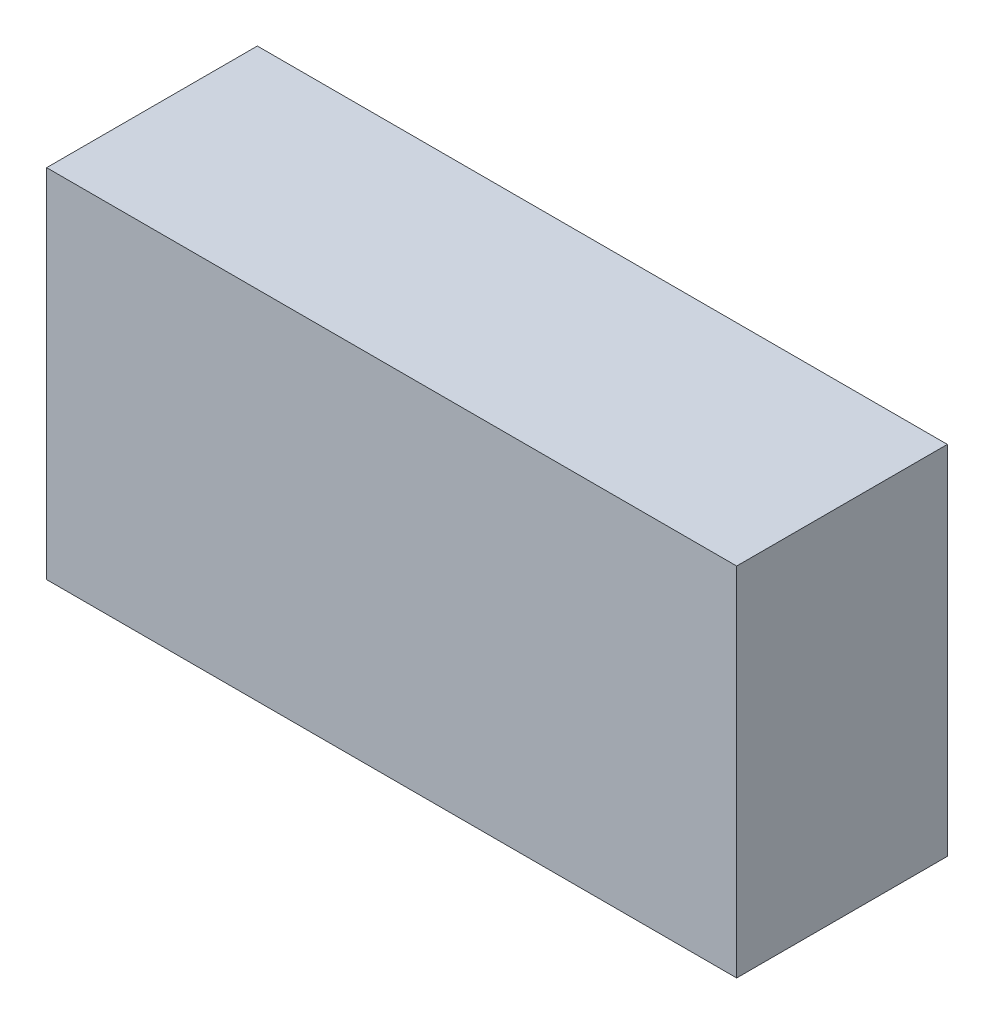
ISO-10303-21;
HEADER;
FILE_DESCRIPTION(('STEP AP214'),'2;1');
FILE_NAME('part.step','',(''),(''),'','','');
FILE_SCHEMA(('AUTOMOTIVE_DESIGN { 1 0 10303 214 1 1 1 1 }'));
ENDSEC;
DATA;
#1=APPLICATION_CONTEXT('core data for automotive mechanical design processes');
#2=APPLICATION_PROTOCOL_DEFINITION('international standard','automotive_design',2000,#1);
#3=PRODUCT_CONTEXT('',#1,'mechanical');
#4=PRODUCT('Part','Part','',(#3));
#5=PRODUCT_RELATED_PRODUCT_CATEGORY('part','',(#4));
#6=PRODUCT_DEFINITION_FORMATION('','',#4);
#7=PRODUCT_DEFINITION_CONTEXT('part definition',#1,'design');
#8=PRODUCT_DEFINITION('design','',#6,#7);
#9=PRODUCT_DEFINITION_SHAPE('','',#8);
#10=(LENGTH_UNIT() NAMED_UNIT(*) SI_UNIT(.MILLI.,.METRE.));
#11=(NAMED_UNIT(*) PLANE_ANGLE_UNIT() SI_UNIT($,.RADIAN.));
#12=(NAMED_UNIT(*) SI_UNIT($,.STERADIAN.) SOLID_ANGLE_UNIT());
#13=UNCERTAINTY_MEASURE_WITH_UNIT(LENGTH_MEASURE(1.E-05),#10,'distance_accuracy_value','');
#14=(GEOMETRIC_REPRESENTATION_CONTEXT(3) GLOBAL_UNCERTAINTY_ASSIGNED_CONTEXT((#13)) GLOBAL_UNIT_ASSIGNED_CONTEXT((#10,
#11,#12)) REPRESENTATION_CONTEXT('',''));
#15=CARTESIAN_POINT('',(0.,0.,0.));
#16=DIRECTION('',(0.,0.,1.));
#17=DIRECTION('',(1.,0.,0.));
#18=AXIS2_PLACEMENT_3D('',#15,#16,#17);
#19=CARTESIAN_POINT('',(9.825,10.16,-3.));
#20=DIRECTION('',(-1.,0.,0.));
#21=DIRECTION('',(0.,0.,1.));
#22=AXIS2_PLACEMENT_3D('',#19,#20,#21);
#23=PLANE('',#22);
#24=DIRECTION('',(0.,0.,-1.));
#25=VECTOR('',#24,1.);
#26=CARTESIAN_POINT('',(9.825,0.,-3.));
#27=LINE('',#26,#25);
#28=CARTESIAN_POINT('',(9.825,0.,3.));
#29=VERTEX_POINT('',#28);
#30=CARTESIAN_POINT('',(9.825,0.,-3.));
#31=VERTEX_POINT('',#30);
#32=EDGE_CURVE('E103',#29,#31,#27,.T.);
#33=ORIENTED_EDGE('',*,*,#32,.T.);
#34=DIRECTION('',(0.,-1.,0.));
#35=VECTOR('',#34,1.);
#36=CARTESIAN_POINT('',(9.825,10.16,-3.));
#37=LINE('',#36,#35);
#38=CARTESIAN_POINT('',(9.825,10.16,-3.));
#39=VERTEX_POINT('',#38);
#40=EDGE_CURVE('E94',#39,#31,#37,.T.);
#41=ORIENTED_EDGE('',*,*,#40,.F.);
#42=DIRECTION('',(0.,0.,-1.));
#43=VECTOR('',#42,1.);
#44=CARTESIAN_POINT('',(9.825,10.16,-3.));
#45=LINE('',#44,#43);
#46=CARTESIAN_POINT('',(9.825,10.16,3.));
#47=VERTEX_POINT('',#46);
#48=EDGE_CURVE('E88',#47,#39,#45,.T.);
#49=ORIENTED_EDGE('',*,*,#48,.F.);
#50=DIRECTION('',(0.,-1.,0.));
#51=VECTOR('',#50,1.);
#52=CARTESIAN_POINT('',(9.825,10.16,3.));
#53=LINE('',#52,#51);
#54=EDGE_CURVE('E99',#47,#29,#53,.T.);
#55=ORIENTED_EDGE('',*,*,#54,.T.);
#56=EDGE_LOOP('',(#33,#41,#49,#55));
#57=FACE_BOUND('',#56,.T.);
#58=ADVANCED_FACE('F36',(#57),#23,.F.);
#59=CARTESIAN_POINT('',(-9.825,10.16,-3.));
#60=DIRECTION('',(0.,0.,1.));
#61=DIRECTION('',(1.,0.,0.));
#62=AXIS2_PLACEMENT_3D('',#59,#60,#61);
#63=PLANE('',#62);
#64=DIRECTION('',(-1.,0.,0.));
#65=VECTOR('',#64,1.);
#66=CARTESIAN_POINT('',(-9.825,0.,-3.));
#67=LINE('',#66,#65);
#68=CARTESIAN_POINT('',(-9.825,0.,-3.));
#69=VERTEX_POINT('',#68);
#70=EDGE_CURVE('E93',#31,#69,#67,.T.);
#71=ORIENTED_EDGE('',*,*,#70,.T.);
#72=DIRECTION('',(0.,-1.,0.));
#73=VECTOR('',#72,1.);
#74=CARTESIAN_POINT('',(-9.825,10.16,-3.));
#75=LINE('',#74,#73);
#76=CARTESIAN_POINT('',(-9.825,10.16,-3.));
#77=VERTEX_POINT('',#76);
#78=EDGE_CURVE('E91',#77,#69,#75,.T.);
#79=ORIENTED_EDGE('',*,*,#78,.F.);
#80=DIRECTION('',(-1.,0.,0.));
#81=VECTOR('',#80,1.);
#82=CARTESIAN_POINT('',(-9.825,10.16,-3.));
#83=LINE('',#82,#81);
#84=EDGE_CURVE('E83',#39,#77,#83,.T.);
#85=ORIENTED_EDGE('',*,*,#84,.F.);
#86=ORIENTED_EDGE('',*,*,#40,.T.);
#87=EDGE_LOOP('',(#71,#79,#85,#86));
#88=FACE_BOUND('',#87,.T.);
#89=ADVANCED_FACE('F92',(#88),#63,.F.);
#90=CARTESIAN_POINT('',(-9.825,10.16,-3.));
#91=DIRECTION('',(1.,0.,0.));
#92=DIRECTION('',(0.,0.,-1.));
#93=AXIS2_PLACEMENT_3D('',#90,#91,#92);
#94=PLANE('',#93);
#95=DIRECTION('',(0.,0.,1.));
#96=VECTOR('',#95,1.);
#97=CARTESIAN_POINT('',(-9.825,0.,-3.));
#98=LINE('',#97,#96);
#99=CARTESIAN_POINT('',(-9.825,0.,3.));
#100=VERTEX_POINT('',#99);
#101=EDGE_CURVE('E69',#69,#100,#98,.T.);
#102=ORIENTED_EDGE('',*,*,#101,.T.);
#103=DIRECTION('',(0.,-1.,0.));
#104=VECTOR('',#103,1.);
#105=CARTESIAN_POINT('',(-9.825,10.16,3.));
#106=LINE('',#105,#104);
#107=CARTESIAN_POINT('',(-9.825,10.16,3.));
#108=VERTEX_POINT('',#107);
#109=EDGE_CURVE('E95',#108,#100,#106,.T.);
#110=ORIENTED_EDGE('',*,*,#109,.F.);
#111=DIRECTION('',(0.,0.,1.));
#112=VECTOR('',#111,1.);
#113=CARTESIAN_POINT('',(-9.825,10.16,-3.));
#114=LINE('',#113,#112);
#115=EDGE_CURVE('E86',#77,#108,#114,.T.);
#116=ORIENTED_EDGE('',*,*,#115,.F.);
#117=ORIENTED_EDGE('',*,*,#78,.T.);
#118=EDGE_LOOP('',(#102,#110,#116,#117));
#119=FACE_BOUND('',#118,.T.);
#120=ADVANCED_FACE('F97',(#119),#94,.F.);
#121=CARTESIAN_POINT('',(-9.825,10.16,3.));
#122=DIRECTION('',(0.,0.,-1.));
#123=DIRECTION('',(-1.,0.,0.));
#124=AXIS2_PLACEMENT_3D('',#121,#122,#123);
#125=PLANE('',#124);
#126=DIRECTION('',(1.,0.,0.));
#127=VECTOR('',#126,1.);
#128=CARTESIAN_POINT('',(-9.825,0.,3.));
#129=LINE('',#128,#127);
#130=EDGE_CURVE('E75',#100,#29,#129,.T.);
#131=ORIENTED_EDGE('',*,*,#130,.T.);
#132=ORIENTED_EDGE('',*,*,#54,.F.);
#133=DIRECTION('',(1.,0.,0.));
#134=VECTOR('',#133,1.);
#135=CARTESIAN_POINT('',(-9.825,10.16,3.));
#136=LINE('',#135,#134);
#137=EDGE_CURVE('E52',#108,#47,#136,.T.);
#138=ORIENTED_EDGE('',*,*,#137,.F.);
#139=ORIENTED_EDGE('',*,*,#109,.T.);
#140=EDGE_LOOP('',(#131,#132,#138,#139));
#141=FACE_BOUND('',#140,.T.);
#142=ADVANCED_FACE('F140',(#141),#125,.F.);
#143=CARTESIAN_POINT('',(0.,10.16,0.));
#144=DIRECTION('',(0.,1.,0.));
#145=DIRECTION('',(0.,0.,1.));
#146=AXIS2_PLACEMENT_3D('',#143,#144,#145);
#147=PLANE('',#146);
#148=ORIENTED_EDGE('',*,*,#48,.T.);
#149=ORIENTED_EDGE('',*,*,#84,.T.);
#150=ORIENTED_EDGE('',*,*,#115,.T.);
#151=ORIENTED_EDGE('',*,*,#137,.T.);
#152=EDGE_LOOP('',(#148,#149,#150,#151));
#153=FACE_BOUND('',#152,.T.);
#154=ADVANCED_FACE('F84',(#153),#147,.T.);
#155=CARTESIAN_POINT('',(0.,0.,0.));
#156=DIRECTION('',(0.,1.,0.));
#157=DIRECTION('',(0.,0.,1.));
#158=AXIS2_PLACEMENT_3D('',#155,#156,#157);
#159=PLANE('',#158);
#160=CARTESIAN_POINT('',(-7.61499999999999,0.,-2.1));
#161=DIRECTION('',(0.,1.,0.));
#162=DIRECTION('',(0.,0.,1.));
#163=AXIS2_PLACEMENT_3D('',#160,#161,#162);
#164=CIRCLE('',#163,0.249999999999999);
#165=CARTESIAN_POINT('',(-7.61499999999999,0.,-1.85));
#166=VERTEX_POINT('',#165);
#167=EDGE_CURVE('E11',#166,#166,#164,.F.);
#168=ORIENTED_EDGE('',*,*,#167,.F.);
#169=EDGE_LOOP('',(#168));
#170=FACE_BOUND('',#169,.T.);
#171=CARTESIAN_POINT('',(-5.07499999999999,0.,-2.1));
#172=DIRECTION('',(0.,1.,0.));
#173=DIRECTION('',(0.,0.,1.));
#174=AXIS2_PLACEMENT_3D('',#171,#172,#173);
#175=CIRCLE('',#174,0.25);
#176=CARTESIAN_POINT('',(-5.07499999999999,0.,-1.85));
#177=VERTEX_POINT('',#176);
#178=EDGE_CURVE('E44',#177,#177,#175,.F.);
#179=ORIENTED_EDGE('',*,*,#178,.F.);
#180=EDGE_LOOP('',(#179));
#181=FACE_BOUND('',#180,.T.);
#182=CARTESIAN_POINT('',(5.085,0.,-2.1));
#183=DIRECTION('',(0.,1.,0.));
#184=DIRECTION('',(0.,0.,1.));
#185=AXIS2_PLACEMENT_3D('',#182,#183,#184);
#186=CIRCLE('',#185,0.25);
#187=CARTESIAN_POINT('',(5.085,0.,-1.85));
#188=VERTEX_POINT('',#187);
#189=EDGE_CURVE('E119',#188,#188,#186,.F.);
#190=ORIENTED_EDGE('',*,*,#189,.F.);
#191=EDGE_LOOP('',(#190));
#192=FACE_BOUND('',#191,.T.);
#193=CARTESIAN_POINT('',(2.545,0.,-2.1));
#194=DIRECTION('',(0.,1.,0.));
#195=DIRECTION('',(0.,0.,1.));
#196=AXIS2_PLACEMENT_3D('',#193,#194,#195);
#197=CIRCLE('',#196,0.250000000000001);
#198=CARTESIAN_POINT('',(2.545,0.,-1.85));
#199=VERTEX_POINT('',#198);
#200=EDGE_CURVE('E116',#199,#199,#197,.F.);
#201=ORIENTED_EDGE('',*,*,#200,.F.);
#202=EDGE_LOOP('',(#201));
#203=FACE_BOUND('',#202,.T.);
#204=CARTESIAN_POINT('',(0.00500000000000001,0.,-2.1));
#205=DIRECTION('',(0.,1.,0.));
#206=DIRECTION('',(0.,0.,1.));
#207=AXIS2_PLACEMENT_3D('',#204,#205,#206);
#208=CIRCLE('',#207,0.25);
#209=CARTESIAN_POINT('',(0.00500000000000001,0.,-1.85));
#210=VERTEX_POINT('',#209);
#211=EDGE_CURVE('E113',#210,#210,#208,.F.);
#212=ORIENTED_EDGE('',*,*,#211,.F.);
#213=EDGE_LOOP('',(#212));
#214=FACE_BOUND('',#213,.T.);
#215=ORIENTED_EDGE('',*,*,#32,.F.);
#216=ORIENTED_EDGE('',*,*,#130,.F.);
#217=ORIENTED_EDGE('',*,*,#101,.F.);
#218=ORIENTED_EDGE('',*,*,#70,.F.);
#219=EDGE_LOOP('',(#215,#216,#217,#218));
#220=FACE_BOUND('',#219,.T.);
#221=ADVANCED_FACE('F126',(#170,#181,#192,#203,#214,#220),#159,.F.);
#222=CARTESIAN_POINT('',(0.00500000000000001,-4.1,-2.1));
#223=DIRECTION('',(0.,1.,0.));
#224=DIRECTION('',(0.,0.,1.));
#225=AXIS2_PLACEMENT_3D('',#222,#223,#224);
#226=CYLINDRICAL_SURFACE('',#225,0.25);
#227=CARTESIAN_POINT('',(0.00500000000000001,-4.1,-2.1));
#228=DIRECTION('',(0.,-1.,0.));
#229=DIRECTION('',(0.,0.,-1.));
#230=AXIS2_PLACEMENT_3D('',#227,#228,#229);
#231=CIRCLE('',#230,0.25);
#232=CARTESIAN_POINT('',(0.00500000000000001,-4.1,-2.35));
#233=VERTEX_POINT('',#232);
#234=EDGE_CURVE('E106',#233,#233,#231,.T.);
#235=ORIENTED_EDGE('',*,*,#234,.F.);
#236=EDGE_LOOP('',(#235));
#237=FACE_BOUND('',#236,.T.);
#238=ORIENTED_EDGE('',*,*,#211,.T.);
#239=EDGE_LOOP('',(#238));
#240=FACE_BOUND('',#239,.T.);
#241=ADVANCED_FACE('F129',(#237,#240),#226,.T.);
#242=CARTESIAN_POINT('',(0.00500000000000001,-4.1,-2.1));
#243=DIRECTION('',(0.,-1.,0.));
#244=DIRECTION('',(0.,0.,-1.));
#245=AXIS2_PLACEMENT_3D('',#242,#243,#244);
#246=PLANE('',#245);
#247=ORIENTED_EDGE('',*,*,#234,.T.);
#248=EDGE_LOOP('',(#247));
#249=FACE_BOUND('',#248,.T.);
#250=ADVANCED_FACE('F188',(#249),#246,.T.);
#251=CARTESIAN_POINT('',(2.545,-4.1,-2.1));
#252=DIRECTION('',(0.,1.,0.));
#253=DIRECTION('',(0.,0.,1.));
#254=AXIS2_PLACEMENT_3D('',#251,#252,#253);
#255=CYLINDRICAL_SURFACE('',#254,0.250000000000001);
#256=CARTESIAN_POINT('',(2.545,-4.1,-2.1));
#257=DIRECTION('',(0.,-1.,0.));
#258=DIRECTION('',(0.,0.,-1.));
#259=AXIS2_PLACEMENT_3D('',#256,#257,#258);
#260=CIRCLE('',#259,0.250000000000001);
#261=CARTESIAN_POINT('',(2.545,-4.1,-2.35));
#262=VERTEX_POINT('',#261);
#263=EDGE_CURVE('E326',#262,#262,#260,.T.);
#264=ORIENTED_EDGE('',*,*,#263,.F.);
#265=EDGE_LOOP('',(#264));
#266=FACE_BOUND('',#265,.T.);
#267=ORIENTED_EDGE('',*,*,#200,.T.);
#268=EDGE_LOOP('',(#267));
#269=FACE_BOUND('',#268,.T.);
#270=ADVANCED_FACE('F199',(#266,#269),#255,.T.);
#271=CARTESIAN_POINT('',(2.545,-4.1,-2.1));
#272=DIRECTION('',(0.,-1.,0.));
#273=DIRECTION('',(0.,0.,-1.));
#274=AXIS2_PLACEMENT_3D('',#271,#272,#273);
#275=PLANE('',#274);
#276=ORIENTED_EDGE('',*,*,#263,.T.);
#277=EDGE_LOOP('',(#276));
#278=FACE_BOUND('',#277,.T.);
#279=ADVANCED_FACE('F210',(#278),#275,.T.);
#280=CARTESIAN_POINT('',(5.085,-4.1,-2.1));
#281=DIRECTION('',(0.,1.,0.));
#282=DIRECTION('',(0.,0.,1.));
#283=AXIS2_PLACEMENT_3D('',#280,#281,#282);
#284=CYLINDRICAL_SURFACE('',#283,0.25);
#285=CARTESIAN_POINT('',(5.085,-4.1,-2.1));
#286=DIRECTION('',(0.,-1.,0.));
#287=DIRECTION('',(0.,0.,-1.));
#288=AXIS2_PLACEMENT_3D('',#285,#286,#287);
#289=CIRCLE('',#288,0.25);
#290=CARTESIAN_POINT('',(5.085,-4.1,-2.35));
#291=VERTEX_POINT('',#290);
#292=EDGE_CURVE('E321',#291,#291,#289,.T.);
#293=ORIENTED_EDGE('',*,*,#292,.F.);
#294=EDGE_LOOP('',(#293));
#295=FACE_BOUND('',#294,.T.);
#296=ORIENTED_EDGE('',*,*,#189,.T.);
#297=EDGE_LOOP('',(#296));
#298=FACE_BOUND('',#297,.T.);
#299=ADVANCED_FACE('F221',(#295,#298),#284,.T.);
#300=CARTESIAN_POINT('',(5.085,-4.1,-2.1));
#301=DIRECTION('',(0.,-1.,0.));
#302=DIRECTION('',(0.,0.,-1.));
#303=AXIS2_PLACEMENT_3D('',#300,#301,#302);
#304=PLANE('',#303);
#305=ORIENTED_EDGE('',*,*,#292,.T.);
#306=EDGE_LOOP('',(#305));
#307=FACE_BOUND('',#306,.T.);
#308=ADVANCED_FACE('F232',(#307),#304,.T.);
#309=CARTESIAN_POINT('',(-5.07499999999999,-4.1,-2.1));
#310=DIRECTION('',(0.,1.,0.));
#311=DIRECTION('',(0.,0.,1.));
#312=AXIS2_PLACEMENT_3D('',#309,#310,#311);
#313=CYLINDRICAL_SURFACE('',#312,0.25);
#314=CARTESIAN_POINT('',(-5.07499999999999,-4.1,-2.1));
#315=DIRECTION('',(0.,-1.,0.));
#316=DIRECTION('',(0.,0.,-1.));
#317=AXIS2_PLACEMENT_3D('',#314,#315,#316);
#318=CIRCLE('',#317,0.25);
#319=CARTESIAN_POINT('',(-5.07499999999999,-4.1,-2.35));
#320=VERTEX_POINT('',#319);
#321=EDGE_CURVE('E318',#320,#320,#318,.T.);
#322=ORIENTED_EDGE('',*,*,#321,.F.);
#323=EDGE_LOOP('',(#322));
#324=FACE_BOUND('',#323,.T.);
#325=ORIENTED_EDGE('',*,*,#178,.T.);
#326=EDGE_LOOP('',(#325));
#327=FACE_BOUND('',#326,.T.);
#328=ADVANCED_FACE('F124',(#324,#327),#313,.T.);
#329=CARTESIAN_POINT('',(-5.07499999999999,-4.1,-2.1));
#330=DIRECTION('',(0.,-1.,0.));
#331=DIRECTION('',(0.,0.,-1.));
#332=AXIS2_PLACEMENT_3D('',#329,#330,#331);
#333=PLANE('',#332);
#334=ORIENTED_EDGE('',*,*,#321,.T.);
#335=EDGE_LOOP('',(#334));
#336=FACE_BOUND('',#335,.T.);
#337=ADVANCED_FACE('F253',(#336),#333,.T.);
#338=CARTESIAN_POINT('',(-7.61499999999999,-4.1,-2.1));
#339=DIRECTION('',(0.,1.,0.));
#340=DIRECTION('',(0.,0.,1.));
#341=AXIS2_PLACEMENT_3D('',#338,#339,#340);
#342=CYLINDRICAL_SURFACE('',#341,0.249999999999999);
#343=CARTESIAN_POINT('',(-7.61499999999999,-4.1,-2.1));
#344=DIRECTION('',(0.,-1.,0.));
#345=DIRECTION('',(0.,0.,-1.));
#346=AXIS2_PLACEMENT_3D('',#343,#344,#345);
#347=CIRCLE('',#346,0.249999999999999);
#348=CARTESIAN_POINT('',(-7.61499999999999,-4.1,-2.35));
#349=VERTEX_POINT('',#348);
#350=EDGE_CURVE('E317',#349,#349,#347,.T.);
#351=ORIENTED_EDGE('',*,*,#350,.F.);
#352=EDGE_LOOP('',(#351));
#353=FACE_BOUND('',#352,.T.);
#354=ORIENTED_EDGE('',*,*,#167,.T.);
#355=EDGE_LOOP('',(#354));
#356=FACE_BOUND('',#355,.T.);
#357=ADVANCED_FACE('F264',(#353,#356),#342,.T.);
#358=CARTESIAN_POINT('',(-7.61499999999999,-4.1,-2.1));
#359=DIRECTION('',(0.,-1.,0.));
#360=DIRECTION('',(0.,0.,-1.));
#361=AXIS2_PLACEMENT_3D('',#358,#359,#360);
#362=PLANE('',#361);
#363=ORIENTED_EDGE('',*,*,#350,.T.);
#364=EDGE_LOOP('',(#363));
#365=FACE_BOUND('',#364,.T.);
#366=ADVANCED_FACE('F275',(#365),#362,.T.);
#367=CLOSED_SHELL('',(#58,#89,#120,#142,#154,#221,#241,#250,#270,#279,#299,#308,#328,#337,#357,#366));
#368=MANIFOLD_SOLID_BREP('B2',#367);
#369=ADVANCED_BREP_SHAPE_REPRESENTATION('',(#18,#368),#14);
#370=SHAPE_DEFINITION_REPRESENTATION(#9,#369);
ENDSEC;
END-ISO-10303-21;
